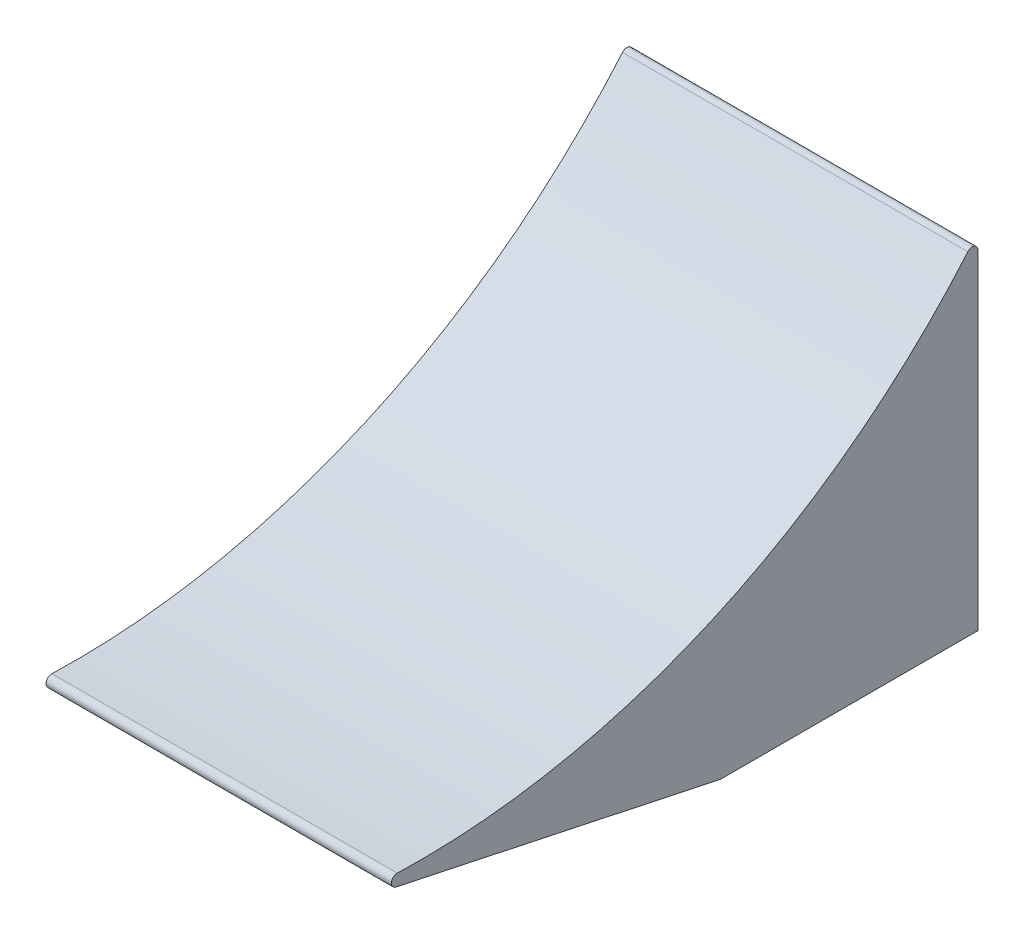
ISO-10303-21;
HEADER;
FILE_DESCRIPTION(('STEP AP214'),'2;1');
FILE_NAME('part.step','',(''),(''),'','','');
FILE_SCHEMA(('AUTOMOTIVE_DESIGN { 1 0 10303 214 1 1 1 1 }'));
ENDSEC;
DATA;
#1=APPLICATION_CONTEXT('core data for automotive mechanical design processes');
#2=APPLICATION_PROTOCOL_DEFINITION('international standard','automotive_design',2000,#1);
#3=PRODUCT_CONTEXT('',#1,'mechanical');
#4=PRODUCT('Part','Part','',(#3));
#5=PRODUCT_RELATED_PRODUCT_CATEGORY('part','',(#4));
#6=PRODUCT_DEFINITION_FORMATION('','',#4);
#7=PRODUCT_DEFINITION_CONTEXT('part definition',#1,'design');
#8=PRODUCT_DEFINITION('design','',#6,#7);
#9=PRODUCT_DEFINITION_SHAPE('','',#8);
#10=(LENGTH_UNIT() NAMED_UNIT(*) SI_UNIT(.MILLI.,.METRE.));
#11=(NAMED_UNIT(*) PLANE_ANGLE_UNIT() SI_UNIT($,.RADIAN.));
#12=(NAMED_UNIT(*) SI_UNIT($,.STERADIAN.) SOLID_ANGLE_UNIT());
#13=UNCERTAINTY_MEASURE_WITH_UNIT(LENGTH_MEASURE(1.E-05),#10,'distance_accuracy_value','');
#14=(GEOMETRIC_REPRESENTATION_CONTEXT(3) GLOBAL_UNCERTAINTY_ASSIGNED_CONTEXT((#13)) GLOBAL_UNIT_ASSIGNED_CONTEXT((#10,
#11,#12)) REPRESENTATION_CONTEXT('',''));
#15=CARTESIAN_POINT('',(0.,0.,0.));
#16=DIRECTION('',(0.,0.,1.));
#17=DIRECTION('',(1.,0.,0.));
#18=AXIS2_PLACEMENT_3D('',#15,#16,#17);
#19=CARTESIAN_POINT('',(38.1,176.532012774421,94.7695931117124));
#20=DIRECTION('',(-1.,0.,0.));
#21=DIRECTION('',(0.,0.,1.));
#22=AXIS2_PLACEMENT_3D('',#19,#20,#21);
#23=CYLINDRICAL_SURFACE('',#22,158.880096286848);
#24=CARTESIAN_POINT('',(-38.1,176.532012774421,94.7695931117124));
#25=DIRECTION('',(1.,0.,0.));
#26=DIRECTION('',(0.,0.,-1.));
#27=AXIS2_PLACEMENT_3D('',#24,#25,#26);
#28=CIRCLE('',#27,158.880096286848);
#29=CARTESIAN_POINT('',(-38.1,17.7287528930667,99.7102051358629));
#30=VERTEX_POINT('',#29);
#31=CARTESIAN_POINT('',(-38.1,73.5143650233039,-26.18597413488));
#32=VERTEX_POINT('',#31);
#33=EDGE_CURVE('E123',#30,#32,#28,.T.);
#34=ORIENTED_EDGE('',*,*,#33,.F.);
#35=DIRECTION('',(-1.,0.,0.));
#36=VECTOR('',#35,1.);
#37=CARTESIAN_POINT('',(38.1,17.7287528930667,99.7102051358629));
#38=LINE('',#37,#36);
#39=CARTESIAN_POINT('',(38.1,17.7287528930667,99.7102051358629));
#40=VERTEX_POINT('',#39);
#41=EDGE_CURVE('E150',#30,#40,#38,.F.);
#42=ORIENTED_EDGE('',*,*,#41,.T.);
#43=CARTESIAN_POINT('',(38.1,176.532012774421,94.7695931117124));
#44=DIRECTION('',(1.,0.,0.));
#45=DIRECTION('',(0.,0.,-1.));
#46=AXIS2_PLACEMENT_3D('',#43,#44,#45);
#47=CIRCLE('',#46,158.880096286848);
#48=CARTESIAN_POINT('',(38.1,73.5143650233039,-26.18597413488));
#49=VERTEX_POINT('',#48);
#50=EDGE_CURVE('E106',#40,#49,#47,.T.);
#51=ORIENTED_EDGE('',*,*,#50,.T.);
#52=DIRECTION('',(-1.,0.,0.));
#53=VECTOR('',#52,1.);
#54=CARTESIAN_POINT('',(38.1,73.5143650233039,-26.18597413488));
#55=LINE('',#54,#53);
#56=EDGE_CURVE('E146',#49,#32,#55,.T.);
#57=ORIENTED_EDGE('',*,*,#56,.T.);
#58=EDGE_LOOP('',(#34,#42,#51,#57));
#59=FACE_BOUND('',#58,.T.);
#60=ADVANCED_FACE('F41',(#59),#23,.F.);
#61=CARTESIAN_POINT('',(38.1,0.,28.422826333445));
#62=DIRECTION('',(0.,-0.978147600733805,0.207911690817761));
#63=DIRECTION('',(0.,-0.207911690817761,-0.978147600733805));
#64=AXIS2_PLACEMENT_3D('',#61,#62,#63);
#65=PLANE('',#64);
#66=DIRECTION('',(0.,0.207911690817761,0.978147600733805));
#67=VECTOR('',#66,1.);
#68=CARTESIAN_POINT('',(38.1,0.,28.422826333445));
#69=LINE('',#68,#67);
#70=CARTESIAN_POINT('',(38.1,0.,28.422826333445));
#71=VERTEX_POINT('',#70);
#72=CARTESIAN_POINT('',(38.1,15.2171196280492,100.0137455151));
#73=VERTEX_POINT('',#72);
#74=EDGE_CURVE('E115',#71,#73,#69,.T.);
#75=ORIENTED_EDGE('',*,*,#74,.T.);
#76=DIRECTION('',(-1.,0.,0.));
#77=VECTOR('',#76,1.);
#78=CARTESIAN_POINT('',(38.1,15.2171196280491,100.0137455151));
#79=LINE('',#78,#77);
#80=CARTESIAN_POINT('',(-38.1,15.2171196280492,100.0137455151));
#81=VERTEX_POINT('',#80);
#82=EDGE_CURVE('E137',#73,#81,#79,.T.);
#83=ORIENTED_EDGE('',*,*,#82,.T.);
#84=DIRECTION('',(0.,0.207911690817761,0.978147600733805));
#85=VECTOR('',#84,1.);
#86=CARTESIAN_POINT('',(-38.1,0.,28.422826333445));
#87=LINE('',#86,#85);
#88=CARTESIAN_POINT('',(-38.1,0.,28.422826333445));
#89=VERTEX_POINT('',#88);
#90=EDGE_CURVE('E132',#89,#81,#87,.T.);
#91=ORIENTED_EDGE('',*,*,#90,.F.);
#92=DIRECTION('',(-1.,0.,0.));
#93=VECTOR('',#92,1.);
#94=CARTESIAN_POINT('',(38.1,0.,28.422826333445));
#95=LINE('',#94,#93);
#96=EDGE_CURVE('E114',#71,#89,#95,.T.);
#97=ORIENTED_EDGE('',*,*,#96,.F.);
#98=EDGE_LOOP('',(#75,#83,#91,#97));
#99=FACE_BOUND('',#98,.T.);
#100=ADVANCED_FACE('F158',(#99),#65,.T.);
#101=CARTESIAN_POINT('',(38.1,0.,-28.422826333445));
#102=DIRECTION('',(0.,-1.,0.));
#103=DIRECTION('',(0.,0.,-1.));
#104=AXIS2_PLACEMENT_3D('',#101,#102,#103);
#105=PLANE('',#104);
#106=DIRECTION('',(0.,0.,1.));
#107=VECTOR('',#106,1.);
#108=CARTESIAN_POINT('',(-38.1,0.,-28.422826333445));
#109=LINE('',#108,#107);
#110=CARTESIAN_POINT('',(-38.1,0.,-28.422826333445));
#111=VERTEX_POINT('',#110);
#112=EDGE_CURVE('E113',#111,#89,#109,.T.);
#113=ORIENTED_EDGE('',*,*,#112,.F.);
#114=DIRECTION('',(-1.,0.,0.));
#115=VECTOR('',#114,1.);
#116=CARTESIAN_POINT('',(38.1,0.,-28.422826333445));
#117=LINE('',#116,#115);
#118=CARTESIAN_POINT('',(38.1,0.,-28.422826333445));
#119=VERTEX_POINT('',#118);
#120=EDGE_CURVE('E101',#119,#111,#117,.T.);
#121=ORIENTED_EDGE('',*,*,#120,.F.);
#122=DIRECTION('',(0.,0.,1.));
#123=VECTOR('',#122,1.);
#124=CARTESIAN_POINT('',(38.1,0.,-28.422826333445));
#125=LINE('',#124,#123);
#126=EDGE_CURVE('E105',#119,#71,#125,.T.);
#127=ORIENTED_EDGE('',*,*,#126,.T.);
#128=ORIENTED_EDGE('',*,*,#96,.T.);
#129=EDGE_LOOP('',(#113,#121,#127,#128));
#130=FACE_BOUND('',#129,.T.);
#131=ADVANCED_FACE('F110',(#130),#105,.T.);
#132=CARTESIAN_POINT('',(38.1,76.2,-28.4228263334451));
#133=DIRECTION('',(0.,0.,-1.));
#134=DIRECTION('',(0.,1.,0.));
#135=AXIS2_PLACEMENT_3D('',#132,#133,#134);
#136=PLANE('',#135);
#137=DIRECTION('',(0.,-1.,0.));
#138=VECTOR('',#137,1.);
#139=CARTESIAN_POINT('',(-38.1,76.2,-28.4228263334451));
#140=LINE('',#139,#138);
#141=CARTESIAN_POINT('',(-38.1,72.6908986754002,-28.4228263334451));
#142=VERTEX_POINT('',#141);
#143=EDGE_CURVE('E127',#142,#111,#140,.T.);
#144=ORIENTED_EDGE('',*,*,#143,.F.);
#145=DIRECTION('',(-1.,0.,0.));
#146=VECTOR('',#145,1.);
#147=CARTESIAN_POINT('',(38.1,72.6908986754002,-28.4228263334451));
#148=LINE('',#147,#146);
#149=CARTESIAN_POINT('',(38.1,72.6908986754002,-28.4228263334451));
#150=VERTEX_POINT('',#149);
#151=EDGE_CURVE('E11',#142,#150,#148,.F.);
#152=ORIENTED_EDGE('',*,*,#151,.T.);
#153=DIRECTION('',(0.,-1.,0.));
#154=VECTOR('',#153,1.);
#155=CARTESIAN_POINT('',(38.1,76.2,-28.4228263334451));
#156=LINE('',#155,#154);
#157=EDGE_CURVE('E98',#150,#119,#156,.T.);
#158=ORIENTED_EDGE('',*,*,#157,.T.);
#159=ORIENTED_EDGE('',*,*,#120,.T.);
#160=EDGE_LOOP('',(#144,#152,#158,#159));
#161=FACE_BOUND('',#160,.T.);
#162=ADVANCED_FACE('F100',(#161),#136,.T.);
#163=CARTESIAN_POINT('',(38.1,176.532012774421,94.7695931117124));
#164=DIRECTION('',(1.,0.,0.));
#165=DIRECTION('',(0.,0.,-1.));
#166=AXIS2_PLACEMENT_3D('',#163,#164,#165);
#167=PLANE('',#166);
#168=ORIENTED_EDGE('',*,*,#50,.F.);
#169=CARTESIAN_POINT('',(38.1,16.4593670809811,99.7496976677615));
#170=DIRECTION('',(1.,0.,0.));
#171=DIRECTION('',(0.,0.,-1.));
#172=AXIS2_PLACEMENT_3D('',#169,#170,#171);
#173=CIRCLE('',#172,1.27);
#174=EDGE_CURVE('E50',#40,#73,#173,.T.);
#175=ORIENTED_EDGE('',*,*,#174,.T.);
#176=ORIENTED_EDGE('',*,*,#74,.F.);
#177=ORIENTED_EDGE('',*,*,#126,.F.);
#178=ORIENTED_EDGE('',*,*,#157,.F.);
#179=CARTESIAN_POINT('',(38.1,72.6908986754002,-27.152826333445));
#180=DIRECTION('',(1.,0.,0.));
#181=DIRECTION('',(0.,0.,-1.));
#182=AXIS2_PLACEMENT_3D('',#179,#180,#181);
#183=CIRCLE('',#182,1.27);
#184=EDGE_CURVE('E66',#150,#49,#183,.T.);
#185=ORIENTED_EDGE('',*,*,#184,.T.);
#186=EDGE_LOOP('',(#168,#175,#176,#177,#178,#185));
#187=FACE_BOUND('',#186,.T.);
#188=ADVANCED_FACE('F117',(#187),#167,.T.);
#189=CARTESIAN_POINT('',(-38.1,176.532012774421,94.7695931117124));
#190=DIRECTION('',(1.,0.,0.));
#191=DIRECTION('',(0.,0.,-1.));
#192=AXIS2_PLACEMENT_3D('',#189,#190,#191);
#193=PLANE('',#192);
#194=ORIENTED_EDGE('',*,*,#90,.T.);
#195=CARTESIAN_POINT('',(-38.1,16.4593670809811,99.7496976677615));
#196=DIRECTION('',(1.,0.,0.));
#197=DIRECTION('',(0.,0.,-1.));
#198=AXIS2_PLACEMENT_3D('',#195,#196,#197);
#199=CIRCLE('',#198,1.27);
#200=EDGE_CURVE('E144',#81,#30,#199,.F.);
#201=ORIENTED_EDGE('',*,*,#200,.T.);
#202=ORIENTED_EDGE('',*,*,#33,.T.);
#203=CARTESIAN_POINT('',(-38.1,72.6908986754002,-27.152826333445));
#204=DIRECTION('',(1.,0.,0.));
#205=DIRECTION('',(0.,0.,-1.));
#206=AXIS2_PLACEMENT_3D('',#203,#204,#205);
#207=CIRCLE('',#206,1.27);
#208=EDGE_CURVE('E141',#32,#142,#207,.F.);
#209=ORIENTED_EDGE('',*,*,#208,.T.);
#210=ORIENTED_EDGE('',*,*,#143,.T.);
#211=ORIENTED_EDGE('',*,*,#112,.T.);
#212=EDGE_LOOP('',(#194,#201,#202,#209,#210,#211));
#213=FACE_BOUND('',#212,.T.);
#214=ADVANCED_FACE('F163',(#213),#193,.F.);
#215=CARTESIAN_POINT('',(38.1,16.4593670809811,99.7496976677615));
#216=DIRECTION('',(-1.,0.,0.));
#217=DIRECTION('',(0.,0.,1.));
#218=AXIS2_PLACEMENT_3D('',#215,#216,#217);
#219=CYLINDRICAL_SURFACE('',#218,1.27);
#220=ORIENTED_EDGE('',*,*,#174,.F.);
#221=ORIENTED_EDGE('',*,*,#41,.F.);
#222=ORIENTED_EDGE('',*,*,#200,.F.);
#223=ORIENTED_EDGE('',*,*,#82,.F.);
#224=EDGE_LOOP('',(#220,#221,#222,#223));
#225=FACE_BOUND('',#224,.T.);
#226=ADVANCED_FACE('F160',(#225),#219,.T.);
#227=CARTESIAN_POINT('',(38.1,72.6908986754002,-27.152826333445));
#228=DIRECTION('',(-1.,0.,0.));
#229=DIRECTION('',(0.,0.,1.));
#230=AXIS2_PLACEMENT_3D('',#227,#228,#229);
#231=CYLINDRICAL_SURFACE('',#230,1.27);
#232=ORIENTED_EDGE('',*,*,#184,.F.);
#233=ORIENTED_EDGE('',*,*,#151,.F.);
#234=ORIENTED_EDGE('',*,*,#208,.F.);
#235=ORIENTED_EDGE('',*,*,#56,.F.);
#236=EDGE_LOOP('',(#232,#233,#234,#235));
#237=FACE_BOUND('',#236,.T.);
#238=ADVANCED_FACE('F43',(#237),#231,.T.);
#239=CLOSED_SHELL('',(#60,#100,#131,#162,#188,#214,#226,#238));
#240=MANIFOLD_SOLID_BREP('B2',#239);
#241=ADVANCED_BREP_SHAPE_REPRESENTATION('',(#18,#240),#14);
#242=SHAPE_DEFINITION_REPRESENTATION(#9,#241);
ENDSEC;
END-ISO-10303-21;
